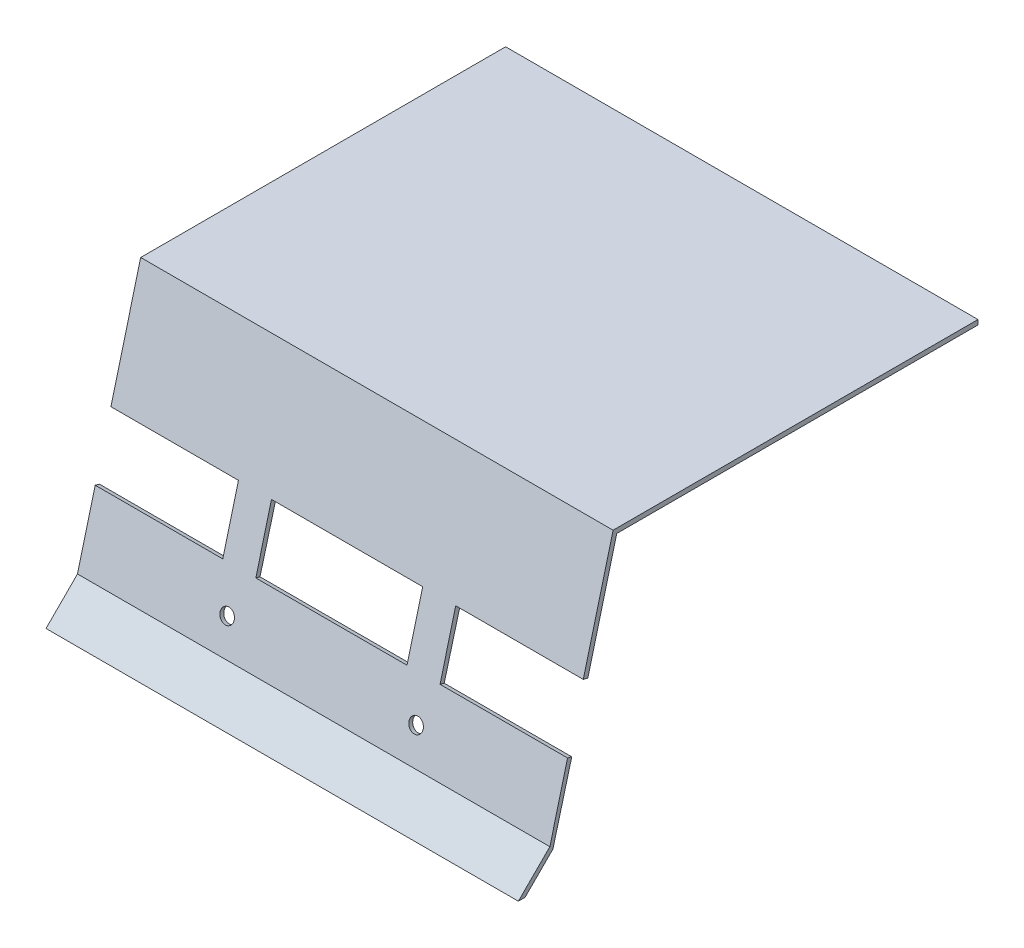
ISO-10303-21;
HEADER;
FILE_DESCRIPTION(('STEP AP214'),'2;1');
FILE_NAME('part.step','',(''),(''),'','','');
FILE_SCHEMA(('AUTOMOTIVE_DESIGN { 1 0 10303 214 1 1 1 1 }'));
ENDSEC;
DATA;
#1=APPLICATION_CONTEXT('core data for automotive mechanical design processes');
#2=APPLICATION_PROTOCOL_DEFINITION('international standard','automotive_design',2000,#1);
#3=PRODUCT_CONTEXT('',#1,'mechanical');
#4=PRODUCT('Part','Part','',(#3));
#5=PRODUCT_RELATED_PRODUCT_CATEGORY('part','',(#4));
#6=PRODUCT_DEFINITION_FORMATION('','',#4);
#7=PRODUCT_DEFINITION_CONTEXT('part definition',#1,'design');
#8=PRODUCT_DEFINITION('design','',#6,#7);
#9=PRODUCT_DEFINITION_SHAPE('','',#8);
#10=(LENGTH_UNIT() NAMED_UNIT(*) SI_UNIT(.MILLI.,.METRE.));
#11=(NAMED_UNIT(*) PLANE_ANGLE_UNIT() SI_UNIT($,.RADIAN.));
#12=(NAMED_UNIT(*) SI_UNIT($,.STERADIAN.) SOLID_ANGLE_UNIT());
#13=UNCERTAINTY_MEASURE_WITH_UNIT(LENGTH_MEASURE(1.E-05),#10,'distance_accuracy_value','');
#14=(GEOMETRIC_REPRESENTATION_CONTEXT(3) GLOBAL_UNCERTAINTY_ASSIGNED_CONTEXT((#13)) GLOBAL_UNIT_ASSIGNED_CONTEXT((#10,
#11,#12)) REPRESENTATION_CONTEXT('',''));
#15=CARTESIAN_POINT('',(0.,0.,0.));
#16=DIRECTION('',(0.,0.,1.));
#17=DIRECTION('',(1.,0.,0.));
#18=AXIS2_PLACEMENT_3D('',#15,#16,#17);
#19=CARTESIAN_POINT('',(100.,0.,0.));
#20=DIRECTION('',(1.,0.,0.));
#21=DIRECTION('',(0.,0.,-1.));
#22=AXIS2_PLACEMENT_3D('',#19,#20,#21);
#23=PLANE('',#22);
#24=DIRECTION('',(0.,0.96766957453146,-0.25222132052248));
#25=VECTOR('',#24,1.);
#26=CARTESIAN_POINT('',(100.,32.825830908478,-14.5174722229214));
#27=LINE('',#26,#25);
#28=CARTESIAN_POINT('',(100.,33.5442570259386,-14.704728688158));
#29=VERTEX_POINT('',#28);
#30=CARTESIAN_POINT('',(100.,57.,-20.8184255764974));
#31=VERTEX_POINT('',#30);
#32=EDGE_CURVE('E201',#29,#31,#27,.T.);
#33=ORIENTED_EDGE('',*,*,#32,.T.);
#34=DIRECTION('',(0.,0.,-1.));
#35=VECTOR('',#34,1.);
#36=CARTESIAN_POINT('',(100.,57.,-63.2985097522054));
#37=LINE('',#36,#35);
#38=CARTESIAN_POINT('',(100.,57.,-97.2985097522054));
#39=VERTEX_POINT('',#38);
#40=EDGE_CURVE('E209',#31,#39,#37,.T.);
#41=ORIENTED_EDGE('',*,*,#40,.T.);
#42=DIRECTION('',(0.,1.,0.));
#43=VECTOR('',#42,1.);
#44=CARTESIAN_POINT('',(100.,57.,-97.2985097522054));
#45=LINE('',#44,#43);
#46=CARTESIAN_POINT('',(100.,58.,-97.2985097522054));
#47=VERTEX_POINT('',#46);
#48=EDGE_CURVE('E222',#39,#47,#45,.T.);
#49=ORIENTED_EDGE('',*,*,#48,.T.);
#50=DIRECTION('',(0.,0.,1.));
#51=VECTOR('',#50,1.);
#52=CARTESIAN_POINT('',(100.,58.,-63.2985097522054));
#53=LINE('',#52,#51);
#54=CARTESIAN_POINT('',(100.,58.,-20.0456631592853));
#55=VERTEX_POINT('',#54);
#56=EDGE_CURVE('E218',#47,#55,#53,.T.);
#57=ORIENTED_EDGE('',*,*,#56,.T.);
#58=DIRECTION('',(0.,-0.96766957453146,0.25222132052248));
#59=VECTOR('',#58,1.);
#60=CARTESIAN_POINT('',(100.,33.0780522290005,-13.54980264839));
#61=LINE('',#60,#59);
#62=CARTESIAN_POINT('',(100.,33.7964783464611,-13.7370591136266));
#63=VERTEX_POINT('',#62);
#64=EDGE_CURVE('E325',#55,#63,#61,.T.);
#65=ORIENTED_EDGE('',*,*,#64,.T.);
#66=DIRECTION('',(0.,0.25222132052248,0.96766957453146));
#67=VECTOR('',#66,1.);
#68=CARTESIAN_POINT('',(100.,30.2632915908169,-27.2924449846226));
#69=LINE('',#68,#67);
#70=EDGE_CURVE('E282',#29,#63,#69,.T.);
#71=ORIENTED_EDGE('',*,*,#70,.F.);
#72=EDGE_LOOP('',(#33,#41,#49,#57,#65,#71));
#73=FACE_BOUND('',#72,.T.);
#74=ADVANCED_FACE('F41',(#73),#23,.T.);
#75=CARTESIAN_POINT('',(0.,0.,0.));
#76=DIRECTION('',(1.,0.,0.));
#77=DIRECTION('',(0.,0.,-1.));
#78=AXIS2_PLACEMENT_3D('',#75,#76,#77);
#79=PLANE('',#78);
#80=DIRECTION('',(0.,-0.96766957453146,0.25222132052248));
#81=VECTOR('',#80,1.);
#82=CARTESIAN_POINT('',(0.,33.0780522290005,-13.54980264839));
#83=LINE('',#82,#81);
#84=CARTESIAN_POINT('',(0.,58.,-20.0456631592853));
#85=VERTEX_POINT('',#84);
#86=CARTESIAN_POINT('',(0.,33.7964783464611,-13.7370591136266));
#87=VERTEX_POINT('',#86);
#88=EDGE_CURVE('E318',#85,#87,#83,.T.);
#89=ORIENTED_EDGE('',*,*,#88,.F.);
#90=DIRECTION('',(0.,0.,1.));
#91=VECTOR('',#90,1.);
#92=CARTESIAN_POINT('',(0.,58.,-97.2985097522054));
#93=LINE('',#92,#91);
#94=CARTESIAN_POINT('',(0.,58.,-97.2985097522054));
#95=VERTEX_POINT('',#94);
#96=EDGE_CURVE('E211',#95,#85,#93,.T.);
#97=ORIENTED_EDGE('',*,*,#96,.F.);
#98=DIRECTION('',(0.,1.,0.));
#99=VECTOR('',#98,1.);
#100=CARTESIAN_POINT('',(0.,57.,-97.2985097522054));
#101=LINE('',#100,#99);
#102=CARTESIAN_POINT('',(0.,57.,-97.2985097522054));
#103=VERTEX_POINT('',#102);
#104=EDGE_CURVE('E217',#103,#95,#101,.T.);
#105=ORIENTED_EDGE('',*,*,#104,.F.);
#106=DIRECTION('',(0.,0.,-1.));
#107=VECTOR('',#106,1.);
#108=CARTESIAN_POINT('',(0.,57.,-20.8184255764974));
#109=LINE('',#108,#107);
#110=CARTESIAN_POINT('',(0.,57.,-20.8184255764974));
#111=VERTEX_POINT('',#110);
#112=EDGE_CURVE('E206',#111,#103,#109,.T.);
#113=ORIENTED_EDGE('',*,*,#112,.F.);
#114=DIRECTION('',(0.,0.96766957453146,-0.25222132052248));
#115=VECTOR('',#114,1.);
#116=CARTESIAN_POINT('',(0.,32.825830908478,-14.5174722229214));
#117=LINE('',#116,#115);
#118=CARTESIAN_POINT('',(0.,33.5442570259386,-14.704728688158));
#119=VERTEX_POINT('',#118);
#120=EDGE_CURVE('E191',#119,#111,#117,.T.);
#121=ORIENTED_EDGE('',*,*,#120,.F.);
#122=DIRECTION('',(0.,0.25222132052248,0.96766957453146));
#123=VECTOR('',#122,1.);
#124=CARTESIAN_POINT('',(0.,30.2632915908169,-27.2924449846226));
#125=LINE('',#124,#123);
#126=EDGE_CURVE('E247',#119,#87,#125,.T.);
#127=ORIENTED_EDGE('',*,*,#126,.T.);
#128=EDGE_LOOP('',(#89,#97,#105,#113,#121,#127));
#129=FACE_BOUND('',#128,.T.);
#130=ADVANCED_FACE('F214',(#129),#79,.F.);
#131=CARTESIAN_POINT('',(100.,0.,0.));
#132=DIRECTION('',(0.,1.,0.));
#133=DIRECTION('',(0.,0.,1.));
#134=AXIS2_PLACEMENT_3D('',#131,#132,#133);
#135=PLANE('',#134);
#136=DIRECTION('',(0.,0.,-1.));
#137=VECTOR('',#136,1.);
#138=CARTESIAN_POINT('',(0.,0.,0.));
#139=LINE('',#138,#137);
#140=CARTESIAN_POINT('',(0.,0.,0.));
#141=VERTEX_POINT('',#140);
#142=CARTESIAN_POINT('',(0.,0.,-1.4142135623731));
#143=VERTEX_POINT('',#142);
#144=EDGE_CURVE('E346',#141,#143,#139,.T.);
#145=ORIENTED_EDGE('',*,*,#144,.T.);
#146=DIRECTION('',(-1.,0.,0.));
#147=VECTOR('',#146,1.);
#148=CARTESIAN_POINT('',(100.,0.,-1.4142135623731));
#149=LINE('',#148,#147);
#150=CARTESIAN_POINT('',(100.,0.,-1.4142135623731));
#151=VERTEX_POINT('',#150);
#152=EDGE_CURVE('E355',#151,#143,#149,.T.);
#153=ORIENTED_EDGE('',*,*,#152,.F.);
#154=DIRECTION('',(0.,0.,-1.));
#155=VECTOR('',#154,1.);
#156=CARTESIAN_POINT('',(100.,0.,0.));
#157=LINE('',#156,#155);
#158=CARTESIAN_POINT('',(100.,0.,0.));
#159=VERTEX_POINT('',#158);
#160=EDGE_CURVE('E336',#159,#151,#157,.T.);
#161=ORIENTED_EDGE('',*,*,#160,.F.);
#162=DIRECTION('',(-1.,0.,0.));
#163=VECTOR('',#162,1.);
#164=CARTESIAN_POINT('',(100.,0.,0.));
#165=LINE('',#164,#163);
#166=EDGE_CURVE('E345',#159,#141,#165,.T.);
#167=ORIENTED_EDGE('',*,*,#166,.T.);
#168=EDGE_LOOP('',(#145,#153,#161,#167));
#169=FACE_BOUND('',#168,.T.);
#170=ADVANCED_FACE('F43',(#169),#135,.F.);
#171=CARTESIAN_POINT('',(100.,0.,-1.4142135623731));
#172=DIRECTION('',(0.,0.707106781186548,0.707106781186548));
#173=DIRECTION('',(0.,-0.707106781186548,0.707106781186548));
#174=AXIS2_PLACEMENT_3D('',#171,#172,#173);
#175=PLANE('',#174);
#176=DIRECTION('',(0.,0.707106781186548,-0.707106781186548));
#177=VECTOR('',#176,1.);
#178=CARTESIAN_POINT('',(0.,0.,-1.4142135623731));
#179=LINE('',#178,#177);
#180=CARTESIAN_POINT('',(0.,5.88429618983227,-7.29850975220536));
#181=VERTEX_POINT('',#180);
#182=EDGE_CURVE('E349',#143,#181,#179,.T.);
#183=ORIENTED_EDGE('',*,*,#182,.T.);
#184=DIRECTION('',(1.,0.,0.));
#185=VECTOR('',#184,1.);
#186=CARTESIAN_POINT('',(0.,5.88429618983227,-7.29850975220536));
#187=LINE('',#186,#185);
#188=CARTESIAN_POINT('',(100.,5.88429618983227,-7.29850975220536));
#189=VERTEX_POINT('',#188);
#190=EDGE_CURVE('E200',#181,#189,#187,.T.);
#191=ORIENTED_EDGE('',*,*,#190,.T.);
#192=DIRECTION('',(0.,0.707106781186548,-0.707106781186548));
#193=VECTOR('',#192,1.);
#194=CARTESIAN_POINT('',(100.,0.,-1.4142135623731));
#195=LINE('',#194,#193);
#196=EDGE_CURVE('E339',#151,#189,#195,.T.);
#197=ORIENTED_EDGE('',*,*,#196,.F.);
#198=ORIENTED_EDGE('',*,*,#152,.T.);
#199=EDGE_LOOP('',(#183,#191,#197,#198));
#200=FACE_BOUND('',#199,.T.);
#201=ADVANCED_FACE('F442',(#200),#175,.F.);
#202=CARTESIAN_POINT('',(100.,0.,0.));
#203=DIRECTION('',(0.,-0.707106781186546,-0.707106781186549));
#204=DIRECTION('',(0.,0.707106781186549,-0.707106781186546));
#205=AXIS2_PLACEMENT_3D('',#202,#203,#204);
#206=PLANE('',#205);
#207=DIRECTION('',(0.,-0.707106781186549,0.707106781186546));
#208=VECTOR('',#207,1.);
#209=CARTESIAN_POINT('',(100.,0.,0.));
#210=LINE('',#209,#208);
#211=CARTESIAN_POINT('',(100.,6.66539015717955,-6.66539015717953));
#212=VERTEX_POINT('',#211);
#213=EDGE_CURVE('E343',#212,#159,#210,.T.);
#214=ORIENTED_EDGE('',*,*,#213,.F.);
#215=DIRECTION('',(1.,0.,0.));
#216=VECTOR('',#215,1.);
#217=CARTESIAN_POINT('',(0.,6.66539015717955,-6.66539015717953));
#218=LINE('',#217,#216);
#219=CARTESIAN_POINT('',(0.,6.66539015717955,-6.66539015717953));
#220=VERTEX_POINT('',#219);
#221=EDGE_CURVE('E324',#220,#212,#218,.T.);
#222=ORIENTED_EDGE('',*,*,#221,.F.);
#223=DIRECTION('',(0.,-0.707106781186549,0.707106781186546));
#224=VECTOR('',#223,1.);
#225=CARTESIAN_POINT('',(0.,0.,0.));
#226=LINE('',#225,#224);
#227=EDGE_CURVE('E340',#220,#141,#226,.T.);
#228=ORIENTED_EDGE('',*,*,#227,.T.);
#229=ORIENTED_EDGE('',*,*,#166,.F.);
#230=EDGE_LOOP('',(#214,#222,#228,#229));
#231=FACE_BOUND('',#230,.T.);
#232=ADVANCED_FACE('F435',(#231),#206,.F.);
#233=DIRECTION('',(0.,0.25222132052248,0.96766957453146));
#234=VECTOR('',#233,1.);
#235=CARTESIAN_POINT('',(100.,17.5220029376707,-23.97145119311));
#236=LINE('',#235,#234);
#237=CARTESIAN_POINT('',(100.,20.8243542082158,-11.3016862331053));
#238=VERTEX_POINT('',#237);
#239=CARTESIAN_POINT('',(100.,21.0551896933148,-10.416065322114));
#240=VERTEX_POINT('',#239);
#241=EDGE_CURVE('E285',#238,#240,#236,.T.);
#242=ORIENTED_EDGE('',*,*,#241,.T.);
#243=EDGE_CURVE('E317',#240,#212,#61,.T.);
#244=ORIENTED_EDGE('',*,*,#243,.T.);
#245=ORIENTED_EDGE('',*,*,#213,.T.);
#246=ORIENTED_EDGE('',*,*,#160,.T.);
#247=ORIENTED_EDGE('',*,*,#196,.T.);
#248=DIRECTION('',(0.,0.965925826289069,-0.258819045102518));
#249=VECTOR('',#248,1.);
#250=CARTESIAN_POINT('',(100.,7.81614784241044,-7.81614784241041));
#251=LINE('',#250,#249);
#252=EDGE_CURVE('E327',#189,#238,#251,.T.);
#253=ORIENTED_EDGE('',*,*,#252,.T.);
#254=EDGE_LOOP('',(#242,#244,#245,#246,#247,#253));
#255=FACE_BOUND('',#254,.T.);
#256=ADVANCED_FACE('F427',(#255),#23,.T.);
#257=CARTESIAN_POINT('',(0.,21.0551896933148,-10.416065322114));
#258=VERTEX_POINT('',#257);
#259=EDGE_CURVE('E321',#258,#220,#83,.T.);
#260=ORIENTED_EDGE('',*,*,#259,.F.);
#261=DIRECTION('',(0.,0.25222132052248,0.96766957453146));
#262=VECTOR('',#261,1.);
#263=CARTESIAN_POINT('',(0.,17.5220029376707,-23.97145119311));
#264=LINE('',#263,#262);
#265=CARTESIAN_POINT('',(0.,20.8243542082158,-11.3016862331053));
#266=VERTEX_POINT('',#265);
#267=EDGE_CURVE('E252',#266,#258,#264,.T.);
#268=ORIENTED_EDGE('',*,*,#267,.F.);
#269=DIRECTION('',(0.,0.965925826289069,-0.258819045102518));
#270=VECTOR('',#269,1.);
#271=CARTESIAN_POINT('',(0.,7.81614784241044,-7.81614784241041));
#272=LINE('',#271,#270);
#273=EDGE_CURVE('E320',#181,#266,#272,.T.);
#274=ORIENTED_EDGE('',*,*,#273,.F.);
#275=ORIENTED_EDGE('',*,*,#182,.F.);
#276=ORIENTED_EDGE('',*,*,#144,.F.);
#277=ORIENTED_EDGE('',*,*,#227,.F.);
#278=EDGE_LOOP('',(#260,#268,#274,#275,#276,#277));
#279=FACE_BOUND('',#278,.T.);
#280=ADVANCED_FACE('F433',(#279),#79,.F.);
#281=CARTESIAN_POINT('',(0.,7.81614784241044,-7.81614784241041));
#282=DIRECTION('',(0.,-0.258819045102518,-0.965925826289069));
#283=DIRECTION('',(0.,0.965925826289069,-0.258819045102518));
#284=AXIS2_PLACEMENT_3D('',#281,#282,#283);
#285=PLANE('',#284);
#286=DIRECTION('',(0.,-0.965925826289069,0.258819045102518));
#287=VECTOR('',#286,1.);
#288=CARTESIAN_POINT('',(27.,7.81614784241044,-7.81614784241041));
#289=LINE('',#288,#287);
#290=CARTESIAN_POINT('',(27.,32.825830908478,-14.5174722229214));
#291=VERTEX_POINT('',#290);
#292=CARTESIAN_POINT('',(27.,20.8243542082158,-11.3016862331053));
#293=VERTEX_POINT('',#292);
#294=EDGE_CURVE('E294',#291,#293,#289,.T.);
#295=ORIENTED_EDGE('',*,*,#294,.F.);
#296=DIRECTION('',(1.,0.,0.));
#297=VECTOR('',#296,1.);
#298=CARTESIAN_POINT('',(0.,32.825830908478,-14.5174722229214));
#299=LINE('',#298,#297);
#300=CARTESIAN_POINT('',(34.,32.825830908478,-14.5174722229214));
#301=VERTEX_POINT('',#300);
#302=EDGE_CURVE('E333',#291,#301,#299,.T.);
#303=ORIENTED_EDGE('',*,*,#302,.T.);
#304=DIRECTION('',(0.,0.965925826289069,-0.258819045102518));
#305=VECTOR('',#304,1.);
#306=CARTESIAN_POINT('',(34.,7.81614784241044,-7.81614784241041));
#307=LINE('',#306,#305);
#308=CARTESIAN_POINT('',(34.,20.8243542082158,-11.3016862331053));
#309=VERTEX_POINT('',#308);
#310=EDGE_CURVE('E290',#309,#301,#307,.T.);
#311=ORIENTED_EDGE('',*,*,#310,.F.);
#312=DIRECTION('',(-1.,0.,0.));
#313=VECTOR('',#312,1.);
#314=CARTESIAN_POINT('',(0.,20.8243542082158,-11.3016862331053));
#315=LINE('',#314,#313);
#316=CARTESIAN_POINT('',(66.,20.8243542082158,-11.3016862331053));
#317=VERTEX_POINT('',#316);
#318=EDGE_CURVE('E298',#317,#309,#315,.T.);
#319=ORIENTED_EDGE('',*,*,#318,.F.);
#320=DIRECTION('',(0.,-0.965925826289069,0.258819045102518));
#321=VECTOR('',#320,1.);
#322=CARTESIAN_POINT('',(66.,7.81614784241044,-7.81614784241041));
#323=LINE('',#322,#321);
#324=CARTESIAN_POINT('',(66.,32.825830908478,-14.5174722229214));
#325=VERTEX_POINT('',#324);
#326=EDGE_CURVE('E292',#325,#317,#323,.T.);
#327=ORIENTED_EDGE('',*,*,#326,.F.);
#328=CARTESIAN_POINT('',(73.,32.825830908478,-14.5174722229214));
#329=VERTEX_POINT('',#328);
#330=EDGE_CURVE('E330',#325,#329,#299,.T.);
#331=ORIENTED_EDGE('',*,*,#330,.T.);
#332=DIRECTION('',(0.,0.965925826289069,-0.258819045102518));
#333=VECTOR('',#332,1.);
#334=CARTESIAN_POINT('',(73.,7.81614784241044,-7.81614784241041));
#335=LINE('',#334,#333);
#336=CARTESIAN_POINT('',(73.,20.8243542082158,-11.3016862331053));
#337=VERTEX_POINT('',#336);
#338=EDGE_CURVE('E249',#337,#329,#335,.T.);
#339=ORIENTED_EDGE('',*,*,#338,.F.);
#340=DIRECTION('',(-1.,0.,0.));
#341=VECTOR('',#340,1.);
#342=CARTESIAN_POINT('',(0.,20.8243542082158,-11.3016862331053));
#343=LINE('',#342,#341);
#344=EDGE_CURVE('E296',#238,#337,#343,.T.);
#345=ORIENTED_EDGE('',*,*,#344,.F.);
#346=ORIENTED_EDGE('',*,*,#252,.F.);
#347=ORIENTED_EDGE('',*,*,#190,.F.);
#348=ORIENTED_EDGE('',*,*,#273,.T.);
#349=DIRECTION('',(-1.,0.,0.));
#350=VECTOR('',#349,1.);
#351=CARTESIAN_POINT('',(0.,20.8243542082158,-11.3016862331053));
#352=LINE('',#351,#350);
#353=EDGE_CURVE('E300',#293,#266,#352,.T.);
#354=ORIENTED_EDGE('',*,*,#353,.F.);
#355=EDGE_LOOP('',(#295,#303,#311,#319,#327,#331,#339,#345,#346,#347,#348,#354));
#356=FACE_BOUND('',#355,.T.);
#357=CARTESIAN_POINT('',(30.,12.9035779948859,-9.17932064331593));
#358=DIRECTION('',(0.,-0.258819045102518,-0.965925826289069));
#359=DIRECTION('',(0.,-0.965925826289069,0.258819045102518));
#360=AXIS2_PLACEMENT_3D('',#357,#358,#359);
#361=ELLIPSE('',#360,1.500034928784,1.5);
#362=CARTESIAN_POINT('',(30.,11.4546555168377,-8.79108303542764));
#363=VERTEX_POINT('',#362);
#364=EDGE_CURVE('E311',#363,#363,#361,.T.);
#365=ORIENTED_EDGE('',*,*,#364,.F.);
#366=EDGE_LOOP('',(#365));
#367=FACE_BOUND('',#366,.T.);
#368=CARTESIAN_POINT('',(70.,12.9035779948859,-9.17932064331593));
#369=DIRECTION('',(0.,-0.258819045102518,-0.965925826289069));
#370=DIRECTION('',(0.,-0.965925826289069,0.258819045102518));
#371=AXIS2_PLACEMENT_3D('',#368,#369,#370);
#372=ELLIPSE('',#371,1.500034928784,1.5);
#373=CARTESIAN_POINT('',(70.,11.4546555168377,-8.79108303542764));
#374=VERTEX_POINT('',#373);
#375=EDGE_CURVE('E306',#374,#374,#372,.T.);
#376=ORIENTED_EDGE('',*,*,#375,.F.);
#377=EDGE_LOOP('',(#376));
#378=FACE_BOUND('',#377,.T.);
#379=ADVANCED_FACE('F375',(#356,#367,#378),#285,.T.);
#380=CARTESIAN_POINT('',(0.,33.0780522290005,-13.54980264839));
#381=DIRECTION('',(0.,0.25222132052248,0.96766957453146));
#382=DIRECTION('',(0.,-0.96766957453146,0.25222132052248));
#383=AXIS2_PLACEMENT_3D('',#380,#381,#382);
#384=PLANE('',#383);
#385=ORIENTED_EDGE('',*,*,#64,.F.);
#386=DIRECTION('',(1.,0.,0.));
#387=VECTOR('',#386,1.);
#388=CARTESIAN_POINT('',(0.,58.,-20.0456631592853));
#389=LINE('',#388,#387);
#390=EDGE_CURVE('E230',#85,#55,#389,.T.);
#391=ORIENTED_EDGE('',*,*,#390,.F.);
#392=ORIENTED_EDGE('',*,*,#88,.T.);
#393=DIRECTION('',(-1.,0.,0.));
#394=VECTOR('',#393,1.);
#395=CARTESIAN_POINT('',(0.,33.7964783464611,-13.7370591136266));
#396=LINE('',#395,#394);
#397=CARTESIAN_POINT('',(27.,33.7964783464611,-13.7370591136266));
#398=VERTEX_POINT('',#397);
#399=EDGE_CURVE('E238',#398,#87,#396,.T.);
#400=ORIENTED_EDGE('',*,*,#399,.F.);
#401=DIRECTION('',(0.,0.96766957453146,-0.25222132052248));
#402=VECTOR('',#401,1.);
#403=CARTESIAN_POINT('',(27.,33.7964783464611,-13.7370591136266));
#404=LINE('',#403,#402);
#405=CARTESIAN_POINT('',(27.,21.0551896933148,-10.416065322114));
#406=VERTEX_POINT('',#405);
#407=EDGE_CURVE('E245',#406,#398,#404,.T.);
#408=ORIENTED_EDGE('',*,*,#407,.F.);
#409=DIRECTION('',(1.,0.,0.));
#410=VECTOR('',#409,1.);
#411=CARTESIAN_POINT('',(0.,21.0551896933148,-10.416065322114));
#412=LINE('',#411,#410);
#413=EDGE_CURVE('E241',#258,#406,#412,.T.);
#414=ORIENTED_EDGE('',*,*,#413,.F.);
#415=ORIENTED_EDGE('',*,*,#259,.T.);
#416=ORIENTED_EDGE('',*,*,#221,.T.);
#417=ORIENTED_EDGE('',*,*,#243,.F.);
#418=DIRECTION('',(1.,0.,0.));
#419=VECTOR('',#418,1.);
#420=CARTESIAN_POINT('',(100.,21.0551896933148,-10.416065322114));
#421=LINE('',#420,#419);
#422=CARTESIAN_POINT('',(73.,21.0551896933148,-10.416065322114));
#423=VERTEX_POINT('',#422);
#424=EDGE_CURVE('E275',#423,#240,#421,.T.);
#425=ORIENTED_EDGE('',*,*,#424,.F.);
#426=DIRECTION('',(0.,-0.96766957453146,0.25222132052248));
#427=VECTOR('',#426,1.);
#428=CARTESIAN_POINT('',(73.,33.7964783464611,-13.7370591136266));
#429=LINE('',#428,#427);
#430=CARTESIAN_POINT('',(73.,33.7964783464611,-13.7370591136266));
#431=VERTEX_POINT('',#430);
#432=EDGE_CURVE('E233',#431,#423,#429,.T.);
#433=ORIENTED_EDGE('',*,*,#432,.F.);
#434=DIRECTION('',(-1.,0.,0.));
#435=VECTOR('',#434,1.);
#436=CARTESIAN_POINT('',(73.,33.7964783464611,-13.7370591136266));
#437=LINE('',#436,#435);
#438=EDGE_CURVE('E277',#63,#431,#437,.T.);
#439=ORIENTED_EDGE('',*,*,#438,.F.);
#440=EDGE_LOOP('',(#385,#391,#392,#400,#408,#414,#415,#416,#417,#425,#433,#439));
#441=FACE_BOUND('',#440,.T.);
#442=DIRECTION('',(-1.,0.,0.));
#443=VECTOR('',#442,1.);
#444=CARTESIAN_POINT('',(34.,33.7964783464611,-13.7370591136266));
#445=LINE('',#444,#443);
#446=CARTESIAN_POINT('',(66.,33.7964783464611,-13.7370591136266));
#447=VERTEX_POINT('',#446);
#448=CARTESIAN_POINT('',(34.,33.7964783464611,-13.7370591136266));
#449=VERTEX_POINT('',#448);
#450=EDGE_CURVE('E56',#447,#449,#445,.T.);
#451=ORIENTED_EDGE('',*,*,#450,.F.);
#452=DIRECTION('',(0.,0.96766957453146,-0.25222132052248));
#453=VECTOR('',#452,1.);
#454=CARTESIAN_POINT('',(66.,33.7964783464611,-13.7370591136266));
#455=LINE('',#454,#453);
#456=CARTESIAN_POINT('',(66.,21.0551896933148,-10.416065322114));
#457=VERTEX_POINT('',#456);
#458=EDGE_CURVE('E263',#457,#447,#455,.T.);
#459=ORIENTED_EDGE('',*,*,#458,.F.);
#460=DIRECTION('',(1.,0.,0.));
#461=VECTOR('',#460,1.);
#462=CARTESIAN_POINT('',(34.,21.0551896933148,-10.416065322114));
#463=LINE('',#462,#461);
#464=CARTESIAN_POINT('',(34.,21.0551896933148,-10.416065322114));
#465=VERTEX_POINT('',#464);
#466=EDGE_CURVE('E260',#465,#457,#463,.T.);
#467=ORIENTED_EDGE('',*,*,#466,.F.);
#468=DIRECTION('',(0.,-0.96766957453146,0.25222132052248));
#469=VECTOR('',#468,1.);
#470=CARTESIAN_POINT('',(34.,33.7964783464611,-13.7370591136266));
#471=LINE('',#470,#469);
#472=EDGE_CURVE('E256',#449,#465,#471,.T.);
#473=ORIENTED_EDGE('',*,*,#472,.F.);
#474=EDGE_LOOP('',(#451,#459,#467,#473));
#475=FACE_BOUND('',#474,.T.);
#476=CARTESIAN_POINT('',(30.,13.1202991821569,-8.34785049382962));
#477=DIRECTION('',(0.,0.25222132052248,0.96766957453146));
#478=DIRECTION('',(0.,-0.96766957453146,0.25222132052248));
#479=AXIS2_PLACEMENT_3D('',#476,#477,#478);
#480=CIRCLE('',#479,1.5);
#481=CARTESIAN_POINT('',(30.,11.6687948203597,-7.9695185130459));
#482=VERTEX_POINT('',#481);
#483=EDGE_CURVE('E303',#482,#482,#480,.T.);
#484=ORIENTED_EDGE('',*,*,#483,.F.);
#485=EDGE_LOOP('',(#484));
#486=FACE_BOUND('',#485,.T.);
#487=CARTESIAN_POINT('',(70.,13.1202991821569,-8.34785049382962));
#488=DIRECTION('',(0.,0.25222132052248,0.96766957453146));
#489=DIRECTION('',(0.,-0.96766957453146,0.25222132052248));
#490=AXIS2_PLACEMENT_3D('',#487,#488,#489);
#491=CIRCLE('',#490,1.5);
#492=CARTESIAN_POINT('',(70.,11.6687948203597,-7.9695185130459));
#493=VERTEX_POINT('',#492);
#494=EDGE_CURVE('E302',#493,#493,#491,.T.);
#495=ORIENTED_EDGE('',*,*,#494,.F.);
#496=EDGE_LOOP('',(#495));
#497=FACE_BOUND('',#496,.T.);
#498=ADVANCED_FACE('F402',(#441,#475,#486,#497),#384,.T.);
#499=CARTESIAN_POINT('',(0.,32.825830908478,-14.5174722229214));
#500=DIRECTION('',(0.,-0.25222132052248,-0.96766957453146));
#501=DIRECTION('',(0.,0.96766957453146,-0.25222132052248));
#502=AXIS2_PLACEMENT_3D('',#499,#500,#501);
#503=PLANE('',#502);
#504=ORIENTED_EDGE('',*,*,#120,.T.);
#505=DIRECTION('',(1.,0.,0.));
#506=VECTOR('',#505,1.);
#507=CARTESIAN_POINT('',(0.,57.,-20.8184255764974));
#508=LINE('',#507,#506);
#509=EDGE_CURVE('E195',#111,#31,#508,.T.);
#510=ORIENTED_EDGE('',*,*,#509,.T.);
#511=ORIENTED_EDGE('',*,*,#32,.F.);
#512=DIRECTION('',(1.,0.,0.));
#513=VECTOR('',#512,1.);
#514=CARTESIAN_POINT('',(0.,33.5442570259386,-14.704728688158));
#515=LINE('',#514,#513);
#516=CARTESIAN_POINT('',(73.,33.5442570259386,-14.704728688158));
#517=VERTEX_POINT('',#516);
#518=EDGE_CURVE('E358',#517,#29,#515,.T.);
#519=ORIENTED_EDGE('',*,*,#518,.F.);
#520=DIRECTION('',(0.,0.96766957453146,-0.25222132052248));
#521=VECTOR('',#520,1.);
#522=CARTESIAN_POINT('',(73.,32.825830908478,-14.5174722229214));
#523=LINE('',#522,#521);
#524=EDGE_CURVE('E360',#329,#517,#523,.T.);
#525=ORIENTED_EDGE('',*,*,#524,.F.);
#526=ORIENTED_EDGE('',*,*,#330,.F.);
#527=DIRECTION('',(0.,-0.96766957453146,0.25222132052248));
#528=VECTOR('',#527,1.);
#529=CARTESIAN_POINT('',(66.,32.825830908478,-14.5174722229214));
#530=LINE('',#529,#528);
#531=CARTESIAN_POINT('',(66.,33.5442570259386,-14.704728688158));
#532=VERTEX_POINT('',#531);
#533=EDGE_CURVE('E367',#532,#325,#530,.T.);
#534=ORIENTED_EDGE('',*,*,#533,.F.);
#535=DIRECTION('',(1.,0.,0.));
#536=VECTOR('',#535,1.);
#537=CARTESIAN_POINT('',(0.,33.5442570259386,-14.704728688158));
#538=LINE('',#537,#536);
#539=CARTESIAN_POINT('',(34.,33.5442570259386,-14.704728688158));
#540=VERTEX_POINT('',#539);
#541=EDGE_CURVE('E365',#540,#532,#538,.T.);
#542=ORIENTED_EDGE('',*,*,#541,.F.);
#543=DIRECTION('',(0.,0.96766957453146,-0.25222132052248));
#544=VECTOR('',#543,1.);
#545=CARTESIAN_POINT('',(34.,32.825830908478,-14.5174722229214));
#546=LINE('',#545,#544);
#547=EDGE_CURVE('E363',#301,#540,#546,.T.);
#548=ORIENTED_EDGE('',*,*,#547,.F.);
#549=ORIENTED_EDGE('',*,*,#302,.F.);
#550=DIRECTION('',(0.,-0.96766957453146,0.25222132052248));
#551=VECTOR('',#550,1.);
#552=CARTESIAN_POINT('',(27.,32.825830908478,-14.5174722229214));
#553=LINE('',#552,#551);
#554=CARTESIAN_POINT('',(27.,33.5442570259386,-14.704728688158));
#555=VERTEX_POINT('',#554);
#556=EDGE_CURVE('E49',#555,#291,#553,.T.);
#557=ORIENTED_EDGE('',*,*,#556,.F.);
#558=DIRECTION('',(1.,0.,0.));
#559=VECTOR('',#558,1.);
#560=CARTESIAN_POINT('',(0.,33.5442570259386,-14.704728688158));
#561=LINE('',#560,#559);
#562=EDGE_CURVE('E11',#119,#555,#561,.T.);
#563=ORIENTED_EDGE('',*,*,#562,.F.);
#564=EDGE_LOOP('',(#504,#510,#511,#519,#525,#526,#534,#542,#548,#549,#557,#563));
#565=FACE_BOUND('',#564,.T.);
#566=ADVANCED_FACE('F193',(#565),#503,.T.);
#567=CARTESIAN_POINT('',(70.,11.8591925795445,-13.1861983664869));
#568=DIRECTION('',(0.,0.25222132052248,0.96766957453146));
#569=DIRECTION('',(0.,-0.96766957453146,0.25222132052248));
#570=AXIS2_PLACEMENT_3D('',#567,#568,#569);
#571=CYLINDRICAL_SURFACE('',#570,1.5);
#572=ORIENTED_EDGE('',*,*,#375,.T.);
#573=EDGE_LOOP('',(#572));
#574=FACE_BOUND('',#573,.T.);
#575=ORIENTED_EDGE('',*,*,#494,.T.);
#576=EDGE_LOOP('',(#575));
#577=FACE_BOUND('',#576,.T.);
#578=ADVANCED_FACE('F411',(#574,#577),#571,.F.);
#579=CARTESIAN_POINT('',(30.,11.8591925795445,-13.1861983664869));
#580=DIRECTION('',(0.,0.25222132052248,0.96766957453146));
#581=DIRECTION('',(0.,-0.96766957453146,0.25222132052248));
#582=AXIS2_PLACEMENT_3D('',#579,#580,#581);
#583=CYLINDRICAL_SURFACE('',#582,1.5);
#584=ORIENTED_EDGE('',*,*,#364,.T.);
#585=EDGE_LOOP('',(#584));
#586=FACE_BOUND('',#585,.T.);
#587=ORIENTED_EDGE('',*,*,#483,.T.);
#588=EDGE_LOOP('',(#587));
#589=FACE_BOUND('',#588,.T.);
#590=ADVANCED_FACE('F413',(#586,#589),#583,.F.);
#591=CARTESIAN_POINT('',(73.,30.2632915908169,-27.2924449846226));
#592=DIRECTION('',(-1.,0.,0.));
#593=DIRECTION('',(0.,0.,1.));
#594=AXIS2_PLACEMENT_3D('',#591,#592,#593);
#595=PLANE('',#594);
#596=ORIENTED_EDGE('',*,*,#338,.T.);
#597=ORIENTED_EDGE('',*,*,#524,.T.);
#598=DIRECTION('',(0.,0.25222132052248,0.96766957453146));
#599=VECTOR('',#598,1.);
#600=CARTESIAN_POINT('',(73.,30.2632915908169,-27.2924449846226));
#601=LINE('',#600,#599);
#602=EDGE_CURVE('E257',#517,#431,#601,.T.);
#603=ORIENTED_EDGE('',*,*,#602,.T.);
#604=ORIENTED_EDGE('',*,*,#432,.T.);
#605=DIRECTION('',(0.,0.25222132052248,0.96766957453146));
#606=VECTOR('',#605,1.);
#607=CARTESIAN_POINT('',(73.,17.5220029376707,-23.97145119311));
#608=LINE('',#607,#606);
#609=EDGE_CURVE('E280',#337,#423,#608,.T.);
#610=ORIENTED_EDGE('',*,*,#609,.F.);
#611=EDGE_LOOP('',(#596,#597,#603,#604,#610));
#612=FACE_BOUND('',#611,.T.);
#613=ADVANCED_FACE('F420',(#612),#595,.F.);
#614=CARTESIAN_POINT('',(73.,30.2632915908169,-27.2924449846226));
#615=DIRECTION('',(0.,0.96766957453146,-0.25222132052248));
#616=DIRECTION('',(0.,0.25222132052248,0.96766957453146));
#617=AXIS2_PLACEMENT_3D('',#614,#615,#616);
#618=PLANE('',#617);
#619=ORIENTED_EDGE('',*,*,#518,.T.);
#620=ORIENTED_EDGE('',*,*,#70,.T.);
#621=ORIENTED_EDGE('',*,*,#438,.T.);
#622=ORIENTED_EDGE('',*,*,#602,.F.);
#623=EDGE_LOOP('',(#619,#620,#621,#622));
#624=FACE_BOUND('',#623,.T.);
#625=ADVANCED_FACE('F467',(#624),#618,.F.);
#626=CARTESIAN_POINT('',(100.,17.5220029376707,-23.97145119311));
#627=DIRECTION('',(0.,-0.96766957453146,0.25222132052248));
#628=DIRECTION('',(0.,-0.25222132052248,-0.96766957453146));
#629=AXIS2_PLACEMENT_3D('',#626,#627,#628);
#630=PLANE('',#629);
#631=ORIENTED_EDGE('',*,*,#344,.T.);
#632=ORIENTED_EDGE('',*,*,#609,.T.);
#633=ORIENTED_EDGE('',*,*,#424,.T.);
#634=ORIENTED_EDGE('',*,*,#241,.F.);
#635=EDGE_LOOP('',(#631,#632,#633,#634));
#636=FACE_BOUND('',#635,.T.);
#637=ADVANCED_FACE('F462',(#636),#630,.F.);
#638=CARTESIAN_POINT('',(34.,30.2632915908169,-27.2924449846226));
#639=DIRECTION('',(0.,0.96766957453146,-0.25222132052248));
#640=DIRECTION('',(0.,0.25222132052248,0.96766957453146));
#641=AXIS2_PLACEMENT_3D('',#638,#639,#640);
#642=PLANE('',#641);
#643=ORIENTED_EDGE('',*,*,#541,.T.);
#644=DIRECTION('',(0.,0.25222132052248,0.96766957453146));
#645=VECTOR('',#644,1.);
#646=CARTESIAN_POINT('',(66.,30.2632915908169,-27.2924449846226));
#647=LINE('',#646,#645);
#648=EDGE_CURVE('E242',#532,#447,#647,.T.);
#649=ORIENTED_EDGE('',*,*,#648,.T.);
#650=ORIENTED_EDGE('',*,*,#450,.T.);
#651=DIRECTION('',(0.,0.25222132052248,0.96766957453146));
#652=VECTOR('',#651,1.);
#653=CARTESIAN_POINT('',(34.,30.2632915908169,-27.2924449846226));
#654=LINE('',#653,#652);
#655=EDGE_CURVE('E266',#540,#449,#654,.T.);
#656=ORIENTED_EDGE('',*,*,#655,.F.);
#657=EDGE_LOOP('',(#643,#649,#650,#656));
#658=FACE_BOUND('',#657,.T.);
#659=ADVANCED_FACE('F385',(#658),#642,.F.);
#660=CARTESIAN_POINT('',(66.,30.2632915908169,-27.2924449846226));
#661=DIRECTION('',(1.,0.,0.));
#662=DIRECTION('',(0.,0.,-1.));
#663=AXIS2_PLACEMENT_3D('',#660,#661,#662);
#664=PLANE('',#663);
#665=ORIENTED_EDGE('',*,*,#326,.T.);
#666=DIRECTION('',(0.,0.25222132052248,0.96766957453146));
#667=VECTOR('',#666,1.);
#668=CARTESIAN_POINT('',(66.,17.5220029376707,-23.97145119311));
#669=LINE('',#668,#667);
#670=EDGE_CURVE('E268',#317,#457,#669,.T.);
#671=ORIENTED_EDGE('',*,*,#670,.T.);
#672=ORIENTED_EDGE('',*,*,#458,.T.);
#673=ORIENTED_EDGE('',*,*,#648,.F.);
#674=ORIENTED_EDGE('',*,*,#533,.T.);
#675=EDGE_LOOP('',(#665,#671,#672,#673,#674));
#676=FACE_BOUND('',#675,.T.);
#677=ADVANCED_FACE('F388',(#676),#664,.F.);
#678=CARTESIAN_POINT('',(34.,17.5220029376707,-23.97145119311));
#679=DIRECTION('',(0.,-0.96766957453146,0.25222132052248));
#680=DIRECTION('',(0.,-0.25222132052248,-0.96766957453146));
#681=AXIS2_PLACEMENT_3D('',#678,#679,#680);
#682=PLANE('',#681);
#683=ORIENTED_EDGE('',*,*,#318,.T.);
#684=DIRECTION('',(0.,0.25222132052248,0.96766957453146));
#685=VECTOR('',#684,1.);
#686=CARTESIAN_POINT('',(34.,17.5220029376707,-23.97145119311));
#687=LINE('',#686,#685);
#688=EDGE_CURVE('E270',#309,#465,#687,.T.);
#689=ORIENTED_EDGE('',*,*,#688,.T.);
#690=ORIENTED_EDGE('',*,*,#466,.T.);
#691=ORIENTED_EDGE('',*,*,#670,.F.);
#692=EDGE_LOOP('',(#683,#689,#690,#691));
#693=FACE_BOUND('',#692,.T.);
#694=ADVANCED_FACE('F399',(#693),#682,.F.);
#695=CARTESIAN_POINT('',(34.,30.2632915908169,-27.2924449846226));
#696=DIRECTION('',(-1.,0.,0.));
#697=DIRECTION('',(0.,0.,1.));
#698=AXIS2_PLACEMENT_3D('',#695,#696,#697);
#699=PLANE('',#698);
#700=ORIENTED_EDGE('',*,*,#310,.T.);
#701=ORIENTED_EDGE('',*,*,#547,.T.);
#702=ORIENTED_EDGE('',*,*,#655,.T.);
#703=ORIENTED_EDGE('',*,*,#472,.T.);
#704=ORIENTED_EDGE('',*,*,#688,.F.);
#705=EDGE_LOOP('',(#700,#701,#702,#703,#704));
#706=FACE_BOUND('',#705,.T.);
#707=ADVANCED_FACE('F382',(#706),#699,.F.);
#708=CARTESIAN_POINT('',(0.,30.2632915908169,-27.2924449846226));
#709=DIRECTION('',(0.,0.96766957453146,-0.25222132052248));
#710=DIRECTION('',(0.,0.25222132052248,0.96766957453146));
#711=AXIS2_PLACEMENT_3D('',#708,#709,#710);
#712=PLANE('',#711);
#713=ORIENTED_EDGE('',*,*,#562,.T.);
#714=DIRECTION('',(0.,0.25222132052248,0.96766957453146));
#715=VECTOR('',#714,1.);
#716=CARTESIAN_POINT('',(27.,30.2632915908169,-27.2924449846226));
#717=LINE('',#716,#715);
#718=EDGE_CURVE('E64',#555,#398,#717,.T.);
#719=ORIENTED_EDGE('',*,*,#718,.T.);
#720=ORIENTED_EDGE('',*,*,#399,.T.);
#721=ORIENTED_EDGE('',*,*,#126,.F.);
#722=EDGE_LOOP('',(#713,#719,#720,#721));
#723=FACE_BOUND('',#722,.T.);
#724=ADVANCED_FACE('F486',(#723),#712,.F.);
#725=CARTESIAN_POINT('',(27.,30.2632915908169,-27.2924449846226));
#726=DIRECTION('',(1.,0.,0.));
#727=DIRECTION('',(0.,0.,-1.));
#728=AXIS2_PLACEMENT_3D('',#725,#726,#727);
#729=PLANE('',#728);
#730=ORIENTED_EDGE('',*,*,#294,.T.);
#731=DIRECTION('',(0.,0.25222132052248,0.96766957453146));
#732=VECTOR('',#731,1.);
#733=CARTESIAN_POINT('',(27.,17.5220029376707,-23.97145119311));
#734=LINE('',#733,#732);
#735=EDGE_CURVE('E250',#293,#406,#734,.T.);
#736=ORIENTED_EDGE('',*,*,#735,.T.);
#737=ORIENTED_EDGE('',*,*,#407,.T.);
#738=ORIENTED_EDGE('',*,*,#718,.F.);
#739=ORIENTED_EDGE('',*,*,#556,.T.);
#740=EDGE_LOOP('',(#730,#736,#737,#738,#739));
#741=FACE_BOUND('',#740,.T.);
#742=ADVANCED_FACE('F369',(#741),#729,.F.);
#743=CARTESIAN_POINT('',(0.,17.5220029376707,-23.97145119311));
#744=DIRECTION('',(0.,-0.96766957453146,0.25222132052248));
#745=DIRECTION('',(0.,-0.25222132052248,-0.96766957453146));
#746=AXIS2_PLACEMENT_3D('',#743,#744,#745);
#747=PLANE('',#746);
#748=ORIENTED_EDGE('',*,*,#353,.T.);
#749=ORIENTED_EDGE('',*,*,#267,.T.);
#750=ORIENTED_EDGE('',*,*,#413,.T.);
#751=ORIENTED_EDGE('',*,*,#735,.F.);
#752=EDGE_LOOP('',(#748,#749,#750,#751));
#753=FACE_BOUND('',#752,.T.);
#754=ADVANCED_FACE('F481',(#753),#747,.F.);
#755=CARTESIAN_POINT('',(0.,58.,-63.2985097522054));
#756=DIRECTION('',(0.,1.,0.));
#757=DIRECTION('',(0.,0.,1.));
#758=AXIS2_PLACEMENT_3D('',#755,#756,#757);
#759=PLANE('',#758);
#760=ORIENTED_EDGE('',*,*,#56,.F.);
#761=DIRECTION('',(1.,0.,0.));
#762=VECTOR('',#761,1.);
#763=CARTESIAN_POINT('',(0.,58.,-97.2985097522054));
#764=LINE('',#763,#762);
#765=EDGE_CURVE('E234',#95,#47,#764,.T.);
#766=ORIENTED_EDGE('',*,*,#765,.F.);
#767=ORIENTED_EDGE('',*,*,#96,.T.);
#768=ORIENTED_EDGE('',*,*,#390,.T.);
#769=EDGE_LOOP('',(#760,#766,#767,#768));
#770=FACE_BOUND('',#769,.T.);
#771=ADVANCED_FACE('F471',(#770),#759,.T.);
#772=CARTESIAN_POINT('',(0.,57.,-97.2985097522054));
#773=DIRECTION('',(0.,0.,-1.));
#774=DIRECTION('',(-1.,0.,0.));
#775=AXIS2_PLACEMENT_3D('',#772,#773,#774);
#776=PLANE('',#775);
#777=ORIENTED_EDGE('',*,*,#48,.F.);
#778=DIRECTION('',(1.,0.,0.));
#779=VECTOR('',#778,1.);
#780=CARTESIAN_POINT('',(0.,57.,-97.2985097522054));
#781=LINE('',#780,#779);
#782=EDGE_CURVE('E210',#103,#39,#781,.T.);
#783=ORIENTED_EDGE('',*,*,#782,.F.);
#784=ORIENTED_EDGE('',*,*,#104,.T.);
#785=ORIENTED_EDGE('',*,*,#765,.T.);
#786=EDGE_LOOP('',(#777,#783,#784,#785));
#787=FACE_BOUND('',#786,.T.);
#788=ADVANCED_FACE('F473',(#787),#776,.T.);
#789=CARTESIAN_POINT('',(0.,57.,-63.2985097522054));
#790=DIRECTION('',(0.,-1.,0.));
#791=DIRECTION('',(0.,0.,-1.));
#792=AXIS2_PLACEMENT_3D('',#789,#790,#791);
#793=PLANE('',#792);
#794=ORIENTED_EDGE('',*,*,#40,.F.);
#795=ORIENTED_EDGE('',*,*,#509,.F.);
#796=ORIENTED_EDGE('',*,*,#112,.T.);
#797=ORIENTED_EDGE('',*,*,#782,.T.);
#798=EDGE_LOOP('',(#794,#795,#796,#797));
#799=FACE_BOUND('',#798,.T.);
#800=ADVANCED_FACE('F205',(#799),#793,.T.);
#801=CLOSED_SHELL('',(#74,#130,#170,#201,#232,#256,#280,#379,#498,#566,#578,#590,#613,#625,#637,
#659,#677,#694,#707,#724,#742,#754,#771,#788,#800));
#802=MANIFOLD_SOLID_BREP('B2',#801);
#803=ADVANCED_BREP_SHAPE_REPRESENTATION('',(#18,#802),#14);
#804=SHAPE_DEFINITION_REPRESENTATION(#9,#803);
ENDSEC;
END-ISO-10303-21;
